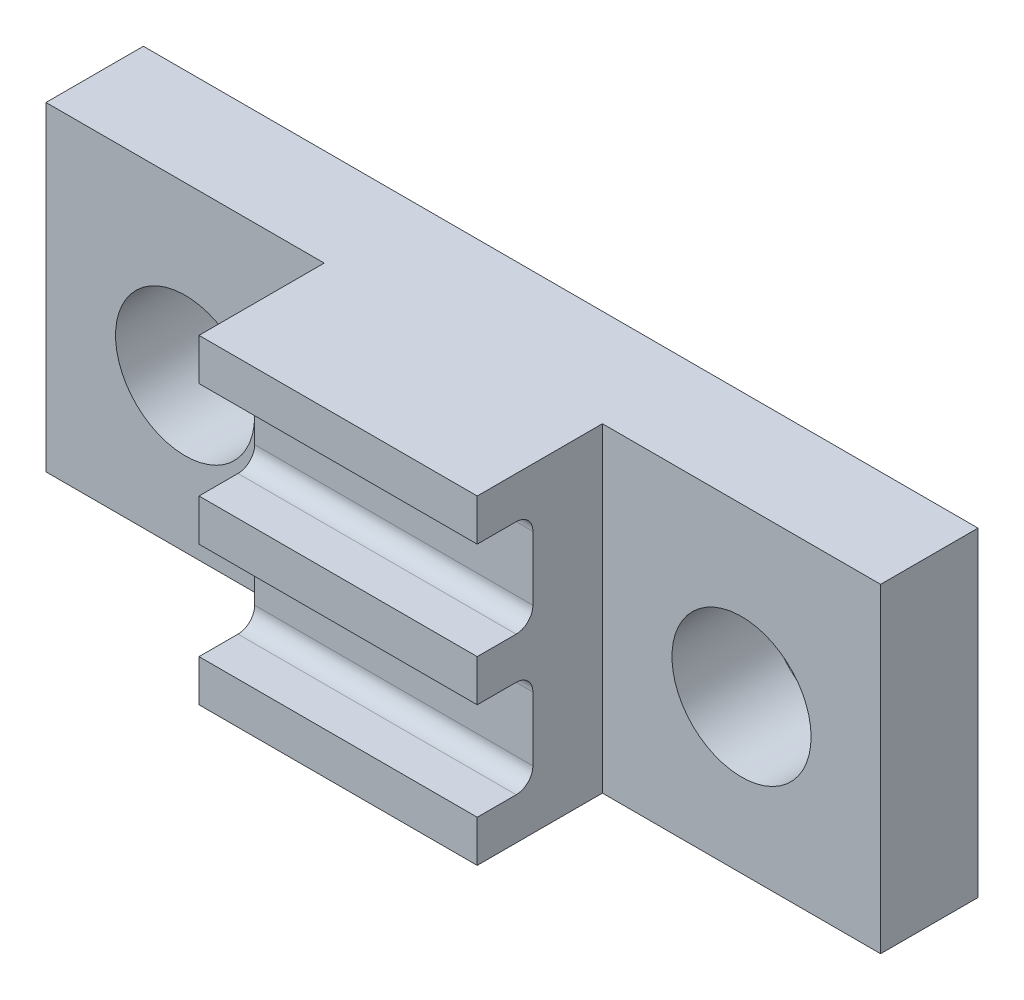
ISO-10303-21;
HEADER;
FILE_DESCRIPTION(('STEP AP214'),'2;1');
FILE_NAME('part.step','',(''),(''),'','','');
FILE_SCHEMA(('AUTOMOTIVE_DESIGN { 1 0 10303 214 1 1 1 1 }'));
ENDSEC;
DATA;
#1=APPLICATION_CONTEXT('core data for automotive mechanical design processes');
#2=APPLICATION_PROTOCOL_DEFINITION('international standard','automotive_design',2000,#1);
#3=PRODUCT_CONTEXT('',#1,'mechanical');
#4=PRODUCT('Part','Part','',(#3));
#5=PRODUCT_RELATED_PRODUCT_CATEGORY('part','',(#4));
#6=PRODUCT_DEFINITION_FORMATION('','',#4);
#7=PRODUCT_DEFINITION_CONTEXT('part definition',#1,'design');
#8=PRODUCT_DEFINITION('design','',#6,#7);
#9=PRODUCT_DEFINITION_SHAPE('','',#8);
#10=(LENGTH_UNIT() NAMED_UNIT(*) SI_UNIT(.MILLI.,.METRE.));
#11=(NAMED_UNIT(*) PLANE_ANGLE_UNIT() SI_UNIT($,.RADIAN.));
#12=(NAMED_UNIT(*) SI_UNIT($,.STERADIAN.) SOLID_ANGLE_UNIT());
#13=UNCERTAINTY_MEASURE_WITH_UNIT(LENGTH_MEASURE(1.E-05),#10,'distance_accuracy_value','');
#14=(GEOMETRIC_REPRESENTATION_CONTEXT(3) GLOBAL_UNCERTAINTY_ASSIGNED_CONTEXT((#13)) GLOBAL_UNIT_ASSIGNED_CONTEXT((#10,
#11,#12)) REPRESENTATION_CONTEXT('',''));
#15=CARTESIAN_POINT('',(0.,0.,0.));
#16=DIRECTION('',(0.,0.,1.));
#17=DIRECTION('',(1.,0.,0.));
#18=AXIS2_PLACEMENT_3D('',#15,#16,#17);
#19=CARTESIAN_POINT('',(0.,0.,8.));
#20=DIRECTION('',(0.,0.,1.));
#21=DIRECTION('',(1.,0.,0.));
#22=AXIS2_PLACEMENT_3D('',#19,#20,#21);
#23=PLANE('',#22);
#24=DIRECTION('',(-1.,0.,0.));
#25=VECTOR('',#24,1.);
#26=CARTESIAN_POINT('',(15.000025,-4.25,8.));
#27=LINE('',#26,#25);
#28=CARTESIAN_POINT('',(5.,-4.25,8.));
#29=VERTEX_POINT('',#28);
#30=CARTESIAN_POINT('',(-5.,-4.25,8.));
#31=VERTEX_POINT('',#30);
#32=EDGE_CURVE('E176',#29,#31,#27,.T.);
#33=ORIENTED_EDGE('',*,*,#32,.T.);
#34=DIRECTION('',(0.,-1.,0.));
#35=VECTOR('',#34,1.);
#36=CARTESIAN_POINT('',(-5.,5.75,8.));
#37=LINE('',#36,#35);
#38=CARTESIAN_POINT('',(-5.,-5.75,8.));
#39=VERTEX_POINT('',#38);
#40=EDGE_CURVE('E185',#31,#39,#37,.T.);
#41=ORIENTED_EDGE('',*,*,#40,.T.);
#42=DIRECTION('',(1.,0.,0.));
#43=VECTOR('',#42,1.);
#44=CARTESIAN_POINT('',(-5.,-5.75,8.));
#45=LINE('',#44,#43);
#46=CARTESIAN_POINT('',(5.,-5.75,8.));
#47=VERTEX_POINT('',#46);
#48=EDGE_CURVE('E204',#39,#47,#45,.T.);
#49=ORIENTED_EDGE('',*,*,#48,.T.);
#50=DIRECTION('',(0.,1.,0.));
#51=VECTOR('',#50,1.);
#52=CARTESIAN_POINT('',(5.,5.75,8.));
#53=LINE('',#52,#51);
#54=EDGE_CURVE('E188',#47,#29,#53,.T.);
#55=ORIENTED_EDGE('',*,*,#54,.T.);
#56=EDGE_LOOP('',(#33,#41,#49,#55));
#57=FACE_BOUND('',#56,.T.);
#58=ADVANCED_FACE('F35',(#57),#23,.T.);
#59=DIRECTION('',(-1.,0.,0.));
#60=VECTOR('',#59,1.);
#61=CARTESIAN_POINT('',(15.000025,-0.75,8.));
#62=LINE('',#61,#60);
#63=CARTESIAN_POINT('',(5.,-0.75,8.));
#64=VERTEX_POINT('',#63);
#65=CARTESIAN_POINT('',(-5.,-0.75,8.));
#66=VERTEX_POINT('',#65);
#67=EDGE_CURVE('E181',#64,#66,#62,.T.);
#68=ORIENTED_EDGE('',*,*,#67,.F.);
#69=CARTESIAN_POINT('',(5.,0.750000000000001,8.));
#70=VERTEX_POINT('',#69);
#71=EDGE_CURVE('E300',#64,#70,#53,.T.);
#72=ORIENTED_EDGE('',*,*,#71,.T.);
#73=DIRECTION('',(1.,0.,0.));
#74=VECTOR('',#73,1.);
#75=CARTESIAN_POINT('',(0.,0.750000000000001,8.));
#76=LINE('',#75,#74);
#77=CARTESIAN_POINT('',(-5.,0.750000000000001,8.));
#78=VERTEX_POINT('',#77);
#79=EDGE_CURVE('E230',#78,#70,#76,.T.);
#80=ORIENTED_EDGE('',*,*,#79,.F.);
#81=EDGE_CURVE('E196',#78,#66,#37,.T.);
#82=ORIENTED_EDGE('',*,*,#81,.T.);
#83=EDGE_LOOP('',(#68,#72,#80,#82));
#84=FACE_BOUND('',#83,.T.);
#85=ADVANCED_FACE('F407',(#84),#23,.T.);
#86=CARTESIAN_POINT('',(0.,0.,3.5));
#87=DIRECTION('',(0.,0.,1.));
#88=DIRECTION('',(1.,0.,0.));
#89=AXIS2_PLACEMENT_3D('',#86,#87,#88);
#90=PLANE('',#89);
#91=DIRECTION('',(0.,1.,0.));
#92=VECTOR('',#91,1.);
#93=CARTESIAN_POINT('',(5.,5.75,3.5));
#94=LINE('',#93,#92);
#95=CARTESIAN_POINT('',(5.,-5.75,3.5));
#96=VERTEX_POINT('',#95);
#97=CARTESIAN_POINT('',(5.,5.75,3.5));
#98=VERTEX_POINT('',#97);
#99=EDGE_CURVE('E218',#96,#98,#94,.T.);
#100=ORIENTED_EDGE('',*,*,#99,.F.);
#101=DIRECTION('',(1.,0.,0.));
#102=VECTOR('',#101,1.);
#103=CARTESIAN_POINT('',(-15.,-5.75,3.5));
#104=LINE('',#103,#102);
#105=CARTESIAN_POINT('',(15.,-5.75,3.5));
#106=VERTEX_POINT('',#105);
#107=EDGE_CURVE('E308',#96,#106,#104,.T.);
#108=ORIENTED_EDGE('',*,*,#107,.T.);
#109=DIRECTION('',(0.,1.,0.));
#110=VECTOR('',#109,1.);
#111=CARTESIAN_POINT('',(15.,5.75,3.5));
#112=LINE('',#111,#110);
#113=CARTESIAN_POINT('',(15.,5.75,3.5));
#114=VERTEX_POINT('',#113);
#115=EDGE_CURVE('E336',#106,#114,#112,.T.);
#116=ORIENTED_EDGE('',*,*,#115,.T.);
#117=DIRECTION('',(-1.,0.,0.));
#118=VECTOR('',#117,1.);
#119=CARTESIAN_POINT('',(-15.,5.75,3.5));
#120=LINE('',#119,#118);
#121=EDGE_CURVE('E347',#114,#98,#120,.T.);
#122=ORIENTED_EDGE('',*,*,#121,.T.);
#123=EDGE_LOOP('',(#100,#108,#116,#122));
#124=FACE_BOUND('',#123,.T.);
#125=CARTESIAN_POINT('',(10.,-0.250000000000001,3.5));
#126=DIRECTION('',(0.,0.,1.));
#127=DIRECTION('',(1.,0.,0.));
#128=AXIS2_PLACEMENT_3D('',#125,#126,#127);
#129=CIRCLE('',#128,2.5);
#130=CARTESIAN_POINT('',(12.5,-0.250000000000001,3.5));
#131=VERTEX_POINT('',#130);
#132=EDGE_CURVE('E323',#131,#131,#129,.T.);
#133=ORIENTED_EDGE('',*,*,#132,.F.);
#134=EDGE_LOOP('',(#133));
#135=FACE_BOUND('',#134,.T.);
#136=ADVANCED_FACE('F386',(#124,#135),#90,.T.);
#137=DIRECTION('',(0.,-1.,0.));
#138=VECTOR('',#137,1.);
#139=CARTESIAN_POINT('',(-5.,5.75,3.5));
#140=LINE('',#139,#138);
#141=CARTESIAN_POINT('',(-5.,5.75,3.5));
#142=VERTEX_POINT('',#141);
#143=CARTESIAN_POINT('',(-5.,-5.75,3.5));
#144=VERTEX_POINT('',#143);
#145=EDGE_CURVE('E221',#142,#144,#140,.T.);
#146=ORIENTED_EDGE('',*,*,#145,.F.);
#147=CARTESIAN_POINT('',(-15.,5.75,3.5));
#148=VERTEX_POINT('',#147);
#149=EDGE_CURVE('E339',#142,#148,#120,.T.);
#150=ORIENTED_EDGE('',*,*,#149,.T.);
#151=DIRECTION('',(0.,-1.,0.));
#152=VECTOR('',#151,1.);
#153=CARTESIAN_POINT('',(-15.,5.75,3.5));
#154=LINE('',#153,#152);
#155=CARTESIAN_POINT('',(-15.,-5.75,3.5));
#156=VERTEX_POINT('',#155);
#157=EDGE_CURVE('E343',#148,#156,#154,.T.);
#158=ORIENTED_EDGE('',*,*,#157,.T.);
#159=EDGE_CURVE('E360',#156,#144,#104,.T.);
#160=ORIENTED_EDGE('',*,*,#159,.T.);
#161=EDGE_LOOP('',(#146,#150,#158,#160));
#162=FACE_BOUND('',#161,.T.);
#163=CARTESIAN_POINT('',(-10.,-0.25,3.5));
#164=DIRECTION('',(0.,0.,1.));
#165=DIRECTION('',(1.,0.,0.));
#166=AXIS2_PLACEMENT_3D('',#163,#164,#165);
#167=CIRCLE('',#166,2.5);
#168=CARTESIAN_POINT('',(-7.5,-0.25,3.5));
#169=VERTEX_POINT('',#168);
#170=EDGE_CURVE('E330',#169,#169,#167,.T.);
#171=ORIENTED_EDGE('',*,*,#170,.F.);
#172=EDGE_LOOP('',(#171));
#173=FACE_BOUND('',#172,.T.);
#174=ADVANCED_FACE('F376',(#162,#173),#90,.T.);
#175=CARTESIAN_POINT('',(0.,0.,0.));
#176=DIRECTION('',(0.,0.,1.));
#177=DIRECTION('',(1.,0.,0.));
#178=AXIS2_PLACEMENT_3D('',#175,#176,#177);
#179=PLANE('',#178);
#180=CARTESIAN_POINT('',(-10.,-0.25,0.));
#181=DIRECTION('',(0.,0.,1.));
#182=DIRECTION('',(1.,0.,0.));
#183=AXIS2_PLACEMENT_3D('',#180,#181,#182);
#184=CIRCLE('',#183,2.5);
#185=CARTESIAN_POINT('',(-7.5,-0.25,0.));
#186=VERTEX_POINT('',#185);
#187=EDGE_CURVE('E328',#186,#186,#184,.T.);
#188=ORIENTED_EDGE('',*,*,#187,.T.);
#189=EDGE_LOOP('',(#188));
#190=FACE_BOUND('',#189,.T.);
#191=DIRECTION('',(0.,1.,0.));
#192=VECTOR('',#191,1.);
#193=CARTESIAN_POINT('',(15.,5.75,0.));
#194=LINE('',#193,#192);
#195=CARTESIAN_POINT('',(15.,-5.75,0.));
#196=VERTEX_POINT('',#195);
#197=CARTESIAN_POINT('',(15.,5.75,0.));
#198=VERTEX_POINT('',#197);
#199=EDGE_CURVE('E333',#196,#198,#194,.T.);
#200=ORIENTED_EDGE('',*,*,#199,.F.);
#201=DIRECTION('',(1.,0.,0.));
#202=VECTOR('',#201,1.);
#203=CARTESIAN_POINT('',(-15.,-5.75,0.));
#204=LINE('',#203,#202);
#205=CARTESIAN_POINT('',(-15.,-5.75,0.));
#206=VERTEX_POINT('',#205);
#207=EDGE_CURVE('E340',#206,#196,#204,.T.);
#208=ORIENTED_EDGE('',*,*,#207,.F.);
#209=DIRECTION('',(0.,-1.,0.));
#210=VECTOR('',#209,1.);
#211=CARTESIAN_POINT('',(-15.,5.75,0.));
#212=LINE('',#211,#210);
#213=CARTESIAN_POINT('',(-15.,5.75,0.));
#214=VERTEX_POINT('',#213);
#215=EDGE_CURVE('E362',#214,#206,#212,.T.);
#216=ORIENTED_EDGE('',*,*,#215,.F.);
#217=DIRECTION('',(-1.,0.,0.));
#218=VECTOR('',#217,1.);
#219=CARTESIAN_POINT('',(-15.,5.75,0.));
#220=LINE('',#219,#218);
#221=EDGE_CURVE('E364',#198,#214,#220,.T.);
#222=ORIENTED_EDGE('',*,*,#221,.F.);
#223=EDGE_LOOP('',(#200,#208,#216,#222));
#224=FACE_BOUND('',#223,.T.);
#225=CARTESIAN_POINT('',(10.,-0.250000000000001,0.));
#226=DIRECTION('',(0.,0.,1.));
#227=DIRECTION('',(1.,0.,0.));
#228=AXIS2_PLACEMENT_3D('',#225,#226,#227);
#229=CIRCLE('',#228,2.5);
#230=CARTESIAN_POINT('',(12.5,-0.250000000000001,0.));
#231=VERTEX_POINT('',#230);
#232=EDGE_CURVE('E319',#231,#231,#229,.T.);
#233=ORIENTED_EDGE('',*,*,#232,.T.);
#234=EDGE_LOOP('',(#233));
#235=FACE_BOUND('',#234,.T.);
#236=ADVANCED_FACE('F395',(#190,#224,#235),#179,.F.);
#237=CARTESIAN_POINT('',(15.,5.75,3.5));
#238=DIRECTION('',(-1.,0.,0.));
#239=DIRECTION('',(0.,-1.,0.));
#240=AXIS2_PLACEMENT_3D('',#237,#238,#239);
#241=PLANE('',#240);
#242=ORIENTED_EDGE('',*,*,#199,.T.);
#243=DIRECTION('',(0.,0.,-1.));
#244=VECTOR('',#243,1.);
#245=CARTESIAN_POINT('',(15.,5.75,3.5));
#246=LINE('',#245,#244);
#247=EDGE_CURVE('E231',#114,#198,#246,.T.);
#248=ORIENTED_EDGE('',*,*,#247,.F.);
#249=ORIENTED_EDGE('',*,*,#115,.F.);
#250=DIRECTION('',(0.,0.,-1.));
#251=VECTOR('',#250,1.);
#252=CARTESIAN_POINT('',(15.,-5.75,3.5));
#253=LINE('',#252,#251);
#254=EDGE_CURVE('E357',#106,#196,#253,.T.);
#255=ORIENTED_EDGE('',*,*,#254,.T.);
#256=EDGE_LOOP('',(#242,#248,#249,#255));
#257=FACE_BOUND('',#256,.T.);
#258=ADVANCED_FACE('F393',(#257),#241,.F.);
#259=CARTESIAN_POINT('',(-15.,5.75,3.5));
#260=DIRECTION('',(0.,-1.,0.));
#261=DIRECTION('',(0.,0.,-1.));
#262=AXIS2_PLACEMENT_3D('',#259,#260,#261);
#263=PLANE('',#262);
#264=ORIENTED_EDGE('',*,*,#221,.T.);
#265=DIRECTION('',(0.,0.,-1.));
#266=VECTOR('',#265,1.);
#267=CARTESIAN_POINT('',(-15.,5.75,3.5));
#268=LINE('',#267,#266);
#269=EDGE_CURVE('E351',#148,#214,#268,.T.);
#270=ORIENTED_EDGE('',*,*,#269,.F.);
#271=ORIENTED_EDGE('',*,*,#149,.F.);
#272=DIRECTION('',(0.,0.,-1.));
#273=VECTOR('',#272,1.);
#274=CARTESIAN_POINT('',(-5.,5.75,8.));
#275=LINE('',#274,#273);
#276=CARTESIAN_POINT('',(-5.,5.75,8.));
#277=VERTEX_POINT('',#276);
#278=EDGE_CURVE('E312',#277,#142,#275,.T.);
#279=ORIENTED_EDGE('',*,*,#278,.F.);
#280=DIRECTION('',(-1.,0.,0.));
#281=VECTOR('',#280,1.);
#282=CARTESIAN_POINT('',(-5.,5.75,8.));
#283=LINE('',#282,#281);
#284=CARTESIAN_POINT('',(5.,5.75,8.));
#285=VERTEX_POINT('',#284);
#286=EDGE_CURVE('E197',#285,#277,#283,.T.);
#287=ORIENTED_EDGE('',*,*,#286,.F.);
#288=DIRECTION('',(0.,0.,-1.));
#289=VECTOR('',#288,1.);
#290=CARTESIAN_POINT('',(5.,5.75,8.));
#291=LINE('',#290,#289);
#292=EDGE_CURVE('E316',#285,#98,#291,.T.);
#293=ORIENTED_EDGE('',*,*,#292,.T.);
#294=ORIENTED_EDGE('',*,*,#121,.F.);
#295=ORIENTED_EDGE('',*,*,#247,.T.);
#296=EDGE_LOOP('',(#264,#270,#271,#279,#287,#293,#294,#295));
#297=FACE_BOUND('',#296,.T.);
#298=ADVANCED_FACE('F390',(#297),#263,.F.);
#299=CARTESIAN_POINT('',(-15.,5.75,3.5));
#300=DIRECTION('',(1.,0.,0.));
#301=DIRECTION('',(0.,1.,0.));
#302=AXIS2_PLACEMENT_3D('',#299,#300,#301);
#303=PLANE('',#302);
#304=ORIENTED_EDGE('',*,*,#215,.T.);
#305=DIRECTION('',(0.,0.,-1.));
#306=VECTOR('',#305,1.);
#307=CARTESIAN_POINT('',(-15.,-5.75,3.5));
#308=LINE('',#307,#306);
#309=EDGE_CURVE('E354',#156,#206,#308,.T.);
#310=ORIENTED_EDGE('',*,*,#309,.F.);
#311=ORIENTED_EDGE('',*,*,#157,.F.);
#312=ORIENTED_EDGE('',*,*,#269,.T.);
#313=EDGE_LOOP('',(#304,#310,#311,#312));
#314=FACE_BOUND('',#313,.T.);
#315=ADVANCED_FACE('F381',(#314),#303,.F.);
#316=CARTESIAN_POINT('',(-15.,-5.75,3.5));
#317=DIRECTION('',(0.,1.,0.));
#318=DIRECTION('',(0.,0.,1.));
#319=AXIS2_PLACEMENT_3D('',#316,#317,#318);
#320=PLANE('',#319);
#321=ORIENTED_EDGE('',*,*,#207,.T.);
#322=ORIENTED_EDGE('',*,*,#254,.F.);
#323=ORIENTED_EDGE('',*,*,#107,.F.);
#324=DIRECTION('',(0.,0.,-1.));
#325=VECTOR('',#324,1.);
#326=CARTESIAN_POINT('',(5.,-5.75,8.));
#327=LINE('',#326,#325);
#328=EDGE_CURVE('E208',#47,#96,#327,.T.);
#329=ORIENTED_EDGE('',*,*,#328,.F.);
#330=ORIENTED_EDGE('',*,*,#48,.F.);
#331=DIRECTION('',(0.,0.,-1.));
#332=VECTOR('',#331,1.);
#333=CARTESIAN_POINT('',(-5.,-5.75,8.));
#334=LINE('',#333,#332);
#335=EDGE_CURVE('E194',#39,#144,#334,.T.);
#336=ORIENTED_EDGE('',*,*,#335,.T.);
#337=ORIENTED_EDGE('',*,*,#159,.F.);
#338=ORIENTED_EDGE('',*,*,#309,.T.);
#339=EDGE_LOOP('',(#321,#322,#323,#329,#330,#336,#337,#338));
#340=FACE_BOUND('',#339,.T.);
#341=ADVANCED_FACE('F385',(#340),#320,.F.);
#342=CARTESIAN_POINT('',(-10.,-0.25,3.5));
#343=DIRECTION('',(0.,0.,-1.));
#344=DIRECTION('',(-1.,0.,0.));
#345=AXIS2_PLACEMENT_3D('',#342,#343,#344);
#346=CYLINDRICAL_SURFACE('',#345,2.5);
#347=ORIENTED_EDGE('',*,*,#170,.T.);
#348=EDGE_LOOP('',(#347));
#349=FACE_BOUND('',#348,.T.);
#350=ORIENTED_EDGE('',*,*,#187,.F.);
#351=EDGE_LOOP('',(#350));
#352=FACE_BOUND('',#351,.T.);
#353=ADVANCED_FACE('F467',(#349,#352),#346,.F.);
#354=CARTESIAN_POINT('',(10.,-0.250000000000001,3.5));
#355=DIRECTION('',(0.,0.,-1.));
#356=DIRECTION('',(-1.,0.,0.));
#357=AXIS2_PLACEMENT_3D('',#354,#355,#356);
#358=CYLINDRICAL_SURFACE('',#357,2.5);
#359=ORIENTED_EDGE('',*,*,#132,.T.);
#360=EDGE_LOOP('',(#359));
#361=FACE_BOUND('',#360,.T.);
#362=ORIENTED_EDGE('',*,*,#232,.F.);
#363=EDGE_LOOP('',(#362));
#364=FACE_BOUND('',#363,.T.);
#365=ADVANCED_FACE('F471',(#361,#364),#358,.F.);
#366=CARTESIAN_POINT('',(5.,5.75,8.));
#367=DIRECTION('',(-1.,0.,0.));
#368=DIRECTION('',(0.,0.,1.));
#369=AXIS2_PLACEMENT_3D('',#366,#367,#368);
#370=PLANE('',#369);
#371=DIRECTION('',(0.,0.,-1.));
#372=VECTOR('',#371,1.);
#373=CARTESIAN_POINT('',(5.,-0.75,8.));
#374=LINE('',#373,#372);
#375=CARTESIAN_POINT('',(5.,-0.75,6.6));
#376=VERTEX_POINT('',#375);
#377=EDGE_CURVE('E189',#64,#376,#374,.T.);
#378=ORIENTED_EDGE('',*,*,#377,.T.);
#379=CARTESIAN_POINT('',(5.,-1.35,6.6));
#380=DIRECTION('',(-1.,0.,0.));
#381=DIRECTION('',(0.,0.,1.));
#382=AXIS2_PLACEMENT_3D('',#379,#380,#381);
#383=CIRCLE('',#382,0.6);
#384=CARTESIAN_POINT('',(5.,-1.35,6.));
#385=VERTEX_POINT('',#384);
#386=EDGE_CURVE('E11',#376,#385,#383,.T.);
#387=ORIENTED_EDGE('',*,*,#386,.T.);
#388=DIRECTION('',(0.,-1.,0.));
#389=VECTOR('',#388,1.);
#390=CARTESIAN_POINT('',(5.,5.75,6.));
#391=LINE('',#390,#389);
#392=CARTESIAN_POINT('',(5.,-3.65,6.));
#393=VERTEX_POINT('',#392);
#394=EDGE_CURVE('E268',#385,#393,#391,.T.);
#395=ORIENTED_EDGE('',*,*,#394,.T.);
#396=CARTESIAN_POINT('',(5.,-3.65,6.6));
#397=DIRECTION('',(-1.,0.,0.));
#398=DIRECTION('',(0.,0.,1.));
#399=AXIS2_PLACEMENT_3D('',#396,#397,#398);
#400=CIRCLE('',#399,0.6);
#401=CARTESIAN_POINT('',(5.,-4.25,6.6));
#402=VERTEX_POINT('',#401);
#403=EDGE_CURVE('E261',#393,#402,#400,.T.);
#404=ORIENTED_EDGE('',*,*,#403,.T.);
#405=DIRECTION('',(0.,0.,1.));
#406=VECTOR('',#405,1.);
#407=CARTESIAN_POINT('',(5.,-4.25,8.));
#408=LINE('',#407,#406);
#409=EDGE_CURVE('E266',#402,#29,#408,.T.);
#410=ORIENTED_EDGE('',*,*,#409,.T.);
#411=ORIENTED_EDGE('',*,*,#54,.F.);
#412=ORIENTED_EDGE('',*,*,#328,.T.);
#413=ORIENTED_EDGE('',*,*,#99,.T.);
#414=ORIENTED_EDGE('',*,*,#292,.F.);
#415=CARTESIAN_POINT('',(5.,4.25,8.));
#416=VERTEX_POINT('',#415);
#417=EDGE_CURVE('E301',#416,#285,#53,.T.);
#418=ORIENTED_EDGE('',*,*,#417,.F.);
#419=DIRECTION('',(0.,0.,-1.));
#420=VECTOR('',#419,1.);
#421=CARTESIAN_POINT('',(5.,4.25,8.));
#422=LINE('',#421,#420);
#423=CARTESIAN_POINT('',(5.,4.25,6.6));
#424=VERTEX_POINT('',#423);
#425=EDGE_CURVE('E292',#416,#424,#422,.T.);
#426=ORIENTED_EDGE('',*,*,#425,.T.);
#427=CARTESIAN_POINT('',(5.,3.65,6.6));
#428=DIRECTION('',(-1.,0.,0.));
#429=DIRECTION('',(0.,0.,1.));
#430=AXIS2_PLACEMENT_3D('',#427,#428,#429);
#431=CIRCLE('',#430,0.6);
#432=CARTESIAN_POINT('',(5.,3.65,6.));
#433=VERTEX_POINT('',#432);
#434=EDGE_CURVE('E250',#424,#433,#431,.T.);
#435=ORIENTED_EDGE('',*,*,#434,.T.);
#436=DIRECTION('',(0.,-1.,0.));
#437=VECTOR('',#436,1.);
#438=CARTESIAN_POINT('',(5.,5.75,6.));
#439=LINE('',#438,#437);
#440=CARTESIAN_POINT('',(5.,1.35,6.));
#441=VERTEX_POINT('',#440);
#442=EDGE_CURVE('E222',#433,#441,#439,.T.);
#443=ORIENTED_EDGE('',*,*,#442,.T.);
#444=CARTESIAN_POINT('',(5.,1.35,6.6));
#445=DIRECTION('',(-1.,0.,0.));
#446=DIRECTION('',(0.,0.,1.));
#447=AXIS2_PLACEMENT_3D('',#444,#445,#446);
#448=CIRCLE('',#447,0.6);
#449=CARTESIAN_POINT('',(5.,0.75,6.6));
#450=VERTEX_POINT('',#449);
#451=EDGE_CURVE('E246',#441,#450,#448,.T.);
#452=ORIENTED_EDGE('',*,*,#451,.T.);
#453=DIRECTION('',(0.,0.,1.));
#454=VECTOR('',#453,1.);
#455=CARTESIAN_POINT('',(5.,0.750000000000001,8.));
#456=LINE('',#455,#454);
#457=EDGE_CURVE('E295',#450,#70,#456,.T.);
#458=ORIENTED_EDGE('',*,*,#457,.T.);
#459=ORIENTED_EDGE('',*,*,#71,.F.);
#460=EDGE_LOOP('',(#378,#387,#395,#404,#410,#411,#412,#413,#414,#418,#426,#435,#443,#452,#458,#459));
#461=FACE_BOUND('',#460,.T.);
#462=ADVANCED_FACE('F265',(#461),#370,.F.);
#463=CARTESIAN_POINT('',(-5.,5.75,8.));
#464=DIRECTION('',(1.,0.,0.));
#465=DIRECTION('',(0.,0.,-1.));
#466=AXIS2_PLACEMENT_3D('',#463,#464,#465);
#467=PLANE('',#466);
#468=ORIENTED_EDGE('',*,*,#40,.F.);
#469=DIRECTION('',(0.,0.,1.));
#470=VECTOR('',#469,1.);
#471=CARTESIAN_POINT('',(-5.,-4.25,6.));
#472=LINE('',#471,#470);
#473=CARTESIAN_POINT('',(-5.,-4.25,6.6));
#474=VERTEX_POINT('',#473);
#475=EDGE_CURVE('E172',#474,#31,#472,.T.);
#476=ORIENTED_EDGE('',*,*,#475,.F.);
#477=CARTESIAN_POINT('',(-5.,-3.65,6.6));
#478=DIRECTION('',(1.,0.,0.));
#479=DIRECTION('',(0.,0.,-1.));
#480=AXIS2_PLACEMENT_3D('',#477,#478,#479);
#481=CIRCLE('',#480,0.6);
#482=CARTESIAN_POINT('',(-5.,-3.65,6.));
#483=VERTEX_POINT('',#482);
#484=EDGE_CURVE('E259',#474,#483,#481,.T.);
#485=ORIENTED_EDGE('',*,*,#484,.T.);
#486=DIRECTION('',(0.,-1.,0.));
#487=VECTOR('',#486,1.);
#488=CARTESIAN_POINT('',(-5.,-0.75,6.));
#489=LINE('',#488,#487);
#490=CARTESIAN_POINT('',(-5.,-1.35,6.));
#491=VERTEX_POINT('',#490);
#492=EDGE_CURVE('E182',#491,#483,#489,.T.);
#493=ORIENTED_EDGE('',*,*,#492,.F.);
#494=CARTESIAN_POINT('',(-5.,-1.35,6.6));
#495=DIRECTION('',(1.,0.,0.));
#496=DIRECTION('',(0.,0.,-1.));
#497=AXIS2_PLACEMENT_3D('',#494,#495,#496);
#498=CIRCLE('',#497,0.6);
#499=CARTESIAN_POINT('',(-5.,-0.75,6.6));
#500=VERTEX_POINT('',#499);
#501=EDGE_CURVE('E43',#491,#500,#498,.T.);
#502=ORIENTED_EDGE('',*,*,#501,.T.);
#503=DIRECTION('',(0.,0.,-1.));
#504=VECTOR('',#503,1.);
#505=CARTESIAN_POINT('',(-5.,-0.75,6.));
#506=LINE('',#505,#504);
#507=EDGE_CURVE('E278',#66,#500,#506,.T.);
#508=ORIENTED_EDGE('',*,*,#507,.F.);
#509=ORIENTED_EDGE('',*,*,#81,.F.);
#510=DIRECTION('',(0.,0.,1.));
#511=VECTOR('',#510,1.);
#512=CARTESIAN_POINT('',(-5.,0.75,6.));
#513=LINE('',#512,#511);
#514=CARTESIAN_POINT('',(-5.,0.75,6.6));
#515=VERTEX_POINT('',#514);
#516=EDGE_CURVE('E290',#515,#78,#513,.T.);
#517=ORIENTED_EDGE('',*,*,#516,.F.);
#518=CARTESIAN_POINT('',(-5.,1.35,6.6));
#519=DIRECTION('',(1.,0.,0.));
#520=DIRECTION('',(0.,0.,-1.));
#521=AXIS2_PLACEMENT_3D('',#518,#519,#520);
#522=CIRCLE('',#521,0.6);
#523=CARTESIAN_POINT('',(-5.,1.35,6.));
#524=VERTEX_POINT('',#523);
#525=EDGE_CURVE('E244',#515,#524,#522,.T.);
#526=ORIENTED_EDGE('',*,*,#525,.T.);
#527=DIRECTION('',(0.,-1.,0.));
#528=VECTOR('',#527,1.);
#529=CARTESIAN_POINT('',(-5.,4.25,6.));
#530=LINE('',#529,#528);
#531=CARTESIAN_POINT('',(-5.,3.65,6.));
#532=VERTEX_POINT('',#531);
#533=EDGE_CURVE('E287',#532,#524,#530,.T.);
#534=ORIENTED_EDGE('',*,*,#533,.F.);
#535=CARTESIAN_POINT('',(-5.,3.65,6.6));
#536=DIRECTION('',(1.,0.,0.));
#537=DIRECTION('',(0.,0.,-1.));
#538=AXIS2_PLACEMENT_3D('',#535,#536,#537);
#539=CIRCLE('',#538,0.6);
#540=CARTESIAN_POINT('',(-5.,4.25,6.6));
#541=VERTEX_POINT('',#540);
#542=EDGE_CURVE('E248',#532,#541,#539,.T.);
#543=ORIENTED_EDGE('',*,*,#542,.T.);
#544=DIRECTION('',(0.,0.,-1.));
#545=VECTOR('',#544,1.);
#546=CARTESIAN_POINT('',(-5.,4.25,6.));
#547=LINE('',#546,#545);
#548=CARTESIAN_POINT('',(-5.,4.25,8.));
#549=VERTEX_POINT('',#548);
#550=EDGE_CURVE('E271',#549,#541,#547,.T.);
#551=ORIENTED_EDGE('',*,*,#550,.F.);
#552=EDGE_CURVE('E199',#277,#549,#37,.T.);
#553=ORIENTED_EDGE('',*,*,#552,.F.);
#554=ORIENTED_EDGE('',*,*,#278,.T.);
#555=ORIENTED_EDGE('',*,*,#145,.T.);
#556=ORIENTED_EDGE('',*,*,#335,.F.);
#557=EDGE_LOOP('',(#468,#476,#485,#493,#502,#508,#509,#517,#526,#534,#543,#551,#553,#554,#555,#556));
#558=FACE_BOUND('',#557,.T.);
#559=ADVANCED_FACE('F191',(#558),#467,.F.);
#560=DIRECTION('',(-1.,0.,0.));
#561=VECTOR('',#560,1.);
#562=CARTESIAN_POINT('',(0.,4.25,8.));
#563=LINE('',#562,#561);
#564=EDGE_CURVE('E228',#416,#549,#563,.T.);
#565=ORIENTED_EDGE('',*,*,#564,.F.);
#566=ORIENTED_EDGE('',*,*,#417,.T.);
#567=ORIENTED_EDGE('',*,*,#286,.T.);
#568=ORIENTED_EDGE('',*,*,#552,.T.);
#569=EDGE_LOOP('',(#565,#566,#567,#568));
#570=FACE_BOUND('',#569,.T.);
#571=ADVANCED_FACE('F409',(#570),#23,.T.);
#572=CARTESIAN_POINT('',(15.000025,4.25,6.));
#573=DIRECTION('',(0.,0.,-1.));
#574=DIRECTION('',(-1.,0.,0.));
#575=AXIS2_PLACEMENT_3D('',#572,#573,#574);
#576=PLANE('',#575);
#577=ORIENTED_EDGE('',*,*,#533,.T.);
#578=DIRECTION('',(-1.,0.,0.));
#579=VECTOR('',#578,1.);
#580=CARTESIAN_POINT('',(5.,1.35,6.));
#581=LINE('',#580,#579);
#582=EDGE_CURVE('E240',#524,#441,#581,.F.);
#583=ORIENTED_EDGE('',*,*,#582,.T.);
#584=ORIENTED_EDGE('',*,*,#442,.F.);
#585=DIRECTION('',(-1.,0.,0.));
#586=VECTOR('',#585,1.);
#587=CARTESIAN_POINT('',(-5.,3.65,6.));
#588=LINE('',#587,#586);
#589=EDGE_CURVE('E237',#433,#532,#588,.T.);
#590=ORIENTED_EDGE('',*,*,#589,.T.);
#591=EDGE_LOOP('',(#577,#583,#584,#590));
#592=FACE_BOUND('',#591,.T.);
#593=ADVANCED_FACE('F417',(#592),#576,.F.);
#594=CARTESIAN_POINT('',(15.000025,0.75,6.));
#595=DIRECTION('',(0.,-1.,0.));
#596=DIRECTION('',(0.,0.,-1.));
#597=AXIS2_PLACEMENT_3D('',#594,#595,#596);
#598=PLANE('',#597);
#599=ORIENTED_EDGE('',*,*,#457,.F.);
#600=DIRECTION('',(-1.,0.,0.));
#601=VECTOR('',#600,1.);
#602=CARTESIAN_POINT('',(-5.,0.75,6.6));
#603=LINE('',#602,#601);
#604=EDGE_CURVE('E234',#450,#515,#603,.T.);
#605=ORIENTED_EDGE('',*,*,#604,.T.);
#606=ORIENTED_EDGE('',*,*,#516,.T.);
#607=ORIENTED_EDGE('',*,*,#79,.T.);
#608=EDGE_LOOP('',(#599,#605,#606,#607));
#609=FACE_BOUND('',#608,.T.);
#610=ADVANCED_FACE('F422',(#609),#598,.F.);
#611=CARTESIAN_POINT('',(15.000025,4.25,6.));
#612=DIRECTION('',(0.,1.,0.));
#613=DIRECTION('',(0.,0.,1.));
#614=AXIS2_PLACEMENT_3D('',#611,#612,#613);
#615=PLANE('',#614);
#616=ORIENTED_EDGE('',*,*,#550,.T.);
#617=DIRECTION('',(-1.,0.,0.));
#618=VECTOR('',#617,1.);
#619=CARTESIAN_POINT('',(5.,4.25,6.6));
#620=LINE('',#619,#618);
#621=EDGE_CURVE('E242',#541,#424,#620,.F.);
#622=ORIENTED_EDGE('',*,*,#621,.T.);
#623=ORIENTED_EDGE('',*,*,#425,.F.);
#624=ORIENTED_EDGE('',*,*,#564,.T.);
#625=EDGE_LOOP('',(#616,#622,#623,#624));
#626=FACE_BOUND('',#625,.T.);
#627=ADVANCED_FACE('F461',(#626),#615,.F.);
#628=CARTESIAN_POINT('',(15.000025,1.35,6.6));
#629=DIRECTION('',(1.,0.,0.));
#630=DIRECTION('',(0.,0.,-1.));
#631=AXIS2_PLACEMENT_3D('',#628,#629,#630);
#632=CYLINDRICAL_SURFACE('',#631,0.6);
#633=ORIENTED_EDGE('',*,*,#451,.F.);
#634=ORIENTED_EDGE('',*,*,#582,.F.);
#635=ORIENTED_EDGE('',*,*,#525,.F.);
#636=ORIENTED_EDGE('',*,*,#604,.F.);
#637=EDGE_LOOP('',(#633,#634,#635,#636));
#638=FACE_BOUND('',#637,.T.);
#639=ADVANCED_FACE('F440',(#638),#632,.F.);
#640=CARTESIAN_POINT('',(15.000025,3.65,6.6));
#641=DIRECTION('',(1.,0.,0.));
#642=DIRECTION('',(0.,0.,-1.));
#643=AXIS2_PLACEMENT_3D('',#640,#641,#642);
#644=CYLINDRICAL_SURFACE('',#643,0.6);
#645=ORIENTED_EDGE('',*,*,#434,.F.);
#646=ORIENTED_EDGE('',*,*,#621,.F.);
#647=ORIENTED_EDGE('',*,*,#542,.F.);
#648=ORIENTED_EDGE('',*,*,#589,.F.);
#649=EDGE_LOOP('',(#645,#646,#647,#648));
#650=FACE_BOUND('',#649,.T.);
#651=ADVANCED_FACE('F432',(#650),#644,.F.);
#652=CARTESIAN_POINT('',(15.000025,-4.25,6.));
#653=DIRECTION('',(0.,-1.,0.));
#654=DIRECTION('',(0.,0.,-1.));
#655=AXIS2_PLACEMENT_3D('',#652,#653,#654);
#656=PLANE('',#655);
#657=ORIENTED_EDGE('',*,*,#409,.F.);
#658=DIRECTION('',(-1.,0.,0.));
#659=VECTOR('',#658,1.);
#660=CARTESIAN_POINT('',(-5.,-4.25,6.6));
#661=LINE('',#660,#659);
#662=EDGE_CURVE('E179',#402,#474,#661,.T.);
#663=ORIENTED_EDGE('',*,*,#662,.T.);
#664=ORIENTED_EDGE('',*,*,#475,.T.);
#665=ORIENTED_EDGE('',*,*,#32,.F.);
#666=EDGE_LOOP('',(#657,#663,#664,#665));
#667=FACE_BOUND('',#666,.T.);
#668=ADVANCED_FACE('F175',(#667),#656,.F.);
#669=CARTESIAN_POINT('',(15.000025,-0.75,6.));
#670=DIRECTION('',(0.,0.,-1.));
#671=DIRECTION('',(-1.,0.,0.));
#672=AXIS2_PLACEMENT_3D('',#669,#670,#671);
#673=PLANE('',#672);
#674=ORIENTED_EDGE('',*,*,#492,.T.);
#675=DIRECTION('',(-1.,0.,0.));
#676=VECTOR('',#675,1.);
#677=CARTESIAN_POINT('',(5.,-3.65,6.));
#678=LINE('',#677,#676);
#679=EDGE_CURVE('E256',#483,#393,#678,.F.);
#680=ORIENTED_EDGE('',*,*,#679,.T.);
#681=ORIENTED_EDGE('',*,*,#394,.F.);
#682=DIRECTION('',(-1.,0.,0.));
#683=VECTOR('',#682,1.);
#684=CARTESIAN_POINT('',(-5.,-1.35,6.));
#685=LINE('',#684,#683);
#686=EDGE_CURVE('E253',#385,#491,#685,.T.);
#687=ORIENTED_EDGE('',*,*,#686,.T.);
#688=EDGE_LOOP('',(#674,#680,#681,#687));
#689=FACE_BOUND('',#688,.T.);
#690=ADVANCED_FACE('F276',(#689),#673,.F.);
#691=CARTESIAN_POINT('',(15.000025,-0.75,6.));
#692=DIRECTION('',(0.,1.,0.));
#693=DIRECTION('',(0.,0.,1.));
#694=AXIS2_PLACEMENT_3D('',#691,#692,#693);
#695=PLANE('',#694);
#696=ORIENTED_EDGE('',*,*,#507,.T.);
#697=DIRECTION('',(-1.,0.,0.));
#698=VECTOR('',#697,1.);
#699=CARTESIAN_POINT('',(5.,-0.75,6.6));
#700=LINE('',#699,#698);
#701=EDGE_CURVE('E50',#500,#376,#700,.F.);
#702=ORIENTED_EDGE('',*,*,#701,.T.);
#703=ORIENTED_EDGE('',*,*,#377,.F.);
#704=ORIENTED_EDGE('',*,*,#67,.T.);
#705=EDGE_LOOP('',(#696,#702,#703,#704));
#706=FACE_BOUND('',#705,.T.);
#707=ADVANCED_FACE('F447',(#706),#695,.F.);
#708=CARTESIAN_POINT('',(15.000025,-3.65,6.6));
#709=DIRECTION('',(1.,0.,0.));
#710=DIRECTION('',(0.,0.,-1.));
#711=AXIS2_PLACEMENT_3D('',#708,#709,#710);
#712=CYLINDRICAL_SURFACE('',#711,0.6);
#713=ORIENTED_EDGE('',*,*,#403,.F.);
#714=ORIENTED_EDGE('',*,*,#679,.F.);
#715=ORIENTED_EDGE('',*,*,#484,.F.);
#716=ORIENTED_EDGE('',*,*,#662,.F.);
#717=EDGE_LOOP('',(#713,#714,#715,#716));
#718=FACE_BOUND('',#717,.T.);
#719=ADVANCED_FACE('F273',(#718),#712,.F.);
#720=CARTESIAN_POINT('',(15.000025,-1.35,6.6));
#721=DIRECTION('',(1.,0.,0.));
#722=DIRECTION('',(0.,0.,-1.));
#723=AXIS2_PLACEMENT_3D('',#720,#721,#722);
#724=CYLINDRICAL_SURFACE('',#723,0.6);
#725=ORIENTED_EDGE('',*,*,#386,.F.);
#726=ORIENTED_EDGE('',*,*,#701,.F.);
#727=ORIENTED_EDGE('',*,*,#501,.F.);
#728=ORIENTED_EDGE('',*,*,#686,.F.);
#729=EDGE_LOOP('',(#725,#726,#727,#728));
#730=FACE_BOUND('',#729,.T.);
#731=ADVANCED_FACE('F37',(#730),#724,.F.);
#732=CLOSED_SHELL('',(#58,#85,#136,#174,#236,#258,#298,#315,#341,#353,#365,#462,#559,#571,#593,
#610,#627,#639,#651,#668,#690,#707,#719,#731));
#733=MANIFOLD_SOLID_BREP('B2',#732);
#734=ADVANCED_BREP_SHAPE_REPRESENTATION('',(#18,#733),#14);
#735=SHAPE_DEFINITION_REPRESENTATION(#9,#734);
ENDSEC;
END-ISO-10303-21;
